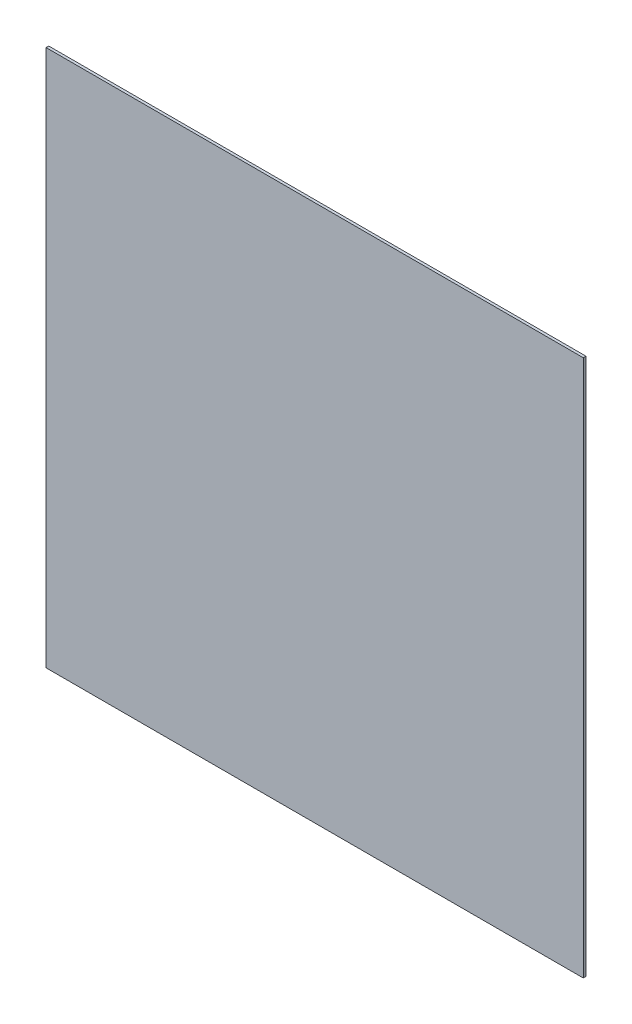
ISO-10303-21;
HEADER;
FILE_DESCRIPTION(('STEP AP214'),'2;1');
FILE_NAME('part.step','',(''),(''),'','','');
FILE_SCHEMA(('AUTOMOTIVE_DESIGN { 1 0 10303 214 1 1 1 1 }'));
ENDSEC;
DATA;
#1=APPLICATION_CONTEXT('core data for automotive mechanical design processes');
#2=APPLICATION_PROTOCOL_DEFINITION('international standard','automotive_design',2000,#1);
#3=PRODUCT_CONTEXT('',#1,'mechanical');
#4=PRODUCT('Part','Part','',(#3));
#5=PRODUCT_RELATED_PRODUCT_CATEGORY('part','',(#4));
#6=PRODUCT_DEFINITION_FORMATION('','',#4);
#7=PRODUCT_DEFINITION_CONTEXT('part definition',#1,'design');
#8=PRODUCT_DEFINITION('design','',#6,#7);
#9=PRODUCT_DEFINITION_SHAPE('','',#8);
#10=(LENGTH_UNIT() NAMED_UNIT(*) SI_UNIT(.MILLI.,.METRE.));
#11=(NAMED_UNIT(*) PLANE_ANGLE_UNIT() SI_UNIT($,.RADIAN.));
#12=(NAMED_UNIT(*) SI_UNIT($,.STERADIAN.) SOLID_ANGLE_UNIT());
#13=UNCERTAINTY_MEASURE_WITH_UNIT(LENGTH_MEASURE(1.E-05),#10,'distance_accuracy_value','');
#14=(GEOMETRIC_REPRESENTATION_CONTEXT(3) GLOBAL_UNCERTAINTY_ASSIGNED_CONTEXT((#13)) GLOBAL_UNIT_ASSIGNED_CONTEXT((#10,
#11,#12)) REPRESENTATION_CONTEXT('',''));
#15=CARTESIAN_POINT('',(0.,0.,0.));
#16=DIRECTION('',(0.,0.,1.));
#17=DIRECTION('',(1.,0.,0.));
#18=AXIS2_PLACEMENT_3D('',#15,#16,#17);
#19=CARTESIAN_POINT('',(113.34,-79.87,1.635));
#20=DIRECTION('',(0.,0.,-1.));
#21=DIRECTION('',(0.,-1.,0.));
#22=AXIS2_PLACEMENT_3D('',#19,#20,#21);
#23=PLANE('',#22);
#24=DIRECTION('',(0.,-1.,0.));
#25=VECTOR('',#24,1.);
#26=CARTESIAN_POINT('',(116.84,-76.37,1.635));
#27=LINE('',#26,#25);
#28=CARTESIAN_POINT('',(116.84,-76.37,1.635));
#29=VERTEX_POINT('',#28);
#30=CARTESIAN_POINT('',(116.84,-83.37,1.635));
#31=VERTEX_POINT('',#30);
#32=EDGE_CURVE('E21',#29,#31,#27,.T.);
#33=ORIENTED_EDGE('',*,*,#32,.F.);
#34=DIRECTION('',(1.,0.,0.));
#35=VECTOR('',#34,1.);
#36=CARTESIAN_POINT('',(109.84,-76.37,1.635));
#37=LINE('',#36,#35);
#38=CARTESIAN_POINT('',(109.84,-76.37,1.635));
#39=VERTEX_POINT('',#38);
#40=EDGE_CURVE('E108',#39,#29,#37,.T.);
#41=ORIENTED_EDGE('',*,*,#40,.F.);
#42=DIRECTION('',(0.,1.,0.));
#43=VECTOR('',#42,1.);
#44=CARTESIAN_POINT('',(109.84,-83.37,1.635));
#45=LINE('',#44,#43);
#46=CARTESIAN_POINT('',(109.84,-83.37,1.635));
#47=VERTEX_POINT('',#46);
#48=EDGE_CURVE('E84',#47,#39,#45,.T.);
#49=ORIENTED_EDGE('',*,*,#48,.F.);
#50=DIRECTION('',(-1.,0.,0.));
#51=VECTOR('',#50,1.);
#52=CARTESIAN_POINT('',(116.84,-83.37,1.635));
#53=LINE('',#52,#51);
#54=EDGE_CURVE('E88',#31,#47,#53,.T.);
#55=ORIENTED_EDGE('',*,*,#54,.F.);
#56=EDGE_LOOP('',(#33,#41,#49,#55));
#57=FACE_BOUND('',#56,.T.);
#58=ADVANCED_FACE('F17',(#57),#23,.F.);
#59=CARTESIAN_POINT('',(113.34,-79.87,1.6));
#60=DIRECTION('',(0.,0.,-1.));
#61=DIRECTION('',(0.,-1.,0.));
#62=AXIS2_PLACEMENT_3D('',#59,#60,#61);
#63=PLANE('',#62);
#64=DIRECTION('',(-1.,0.,0.));
#65=VECTOR('',#64,1.);
#66=CARTESIAN_POINT('',(116.84,-83.37,1.6));
#67=LINE('',#66,#65);
#68=CARTESIAN_POINT('',(116.84,-83.37,1.6));
#69=VERTEX_POINT('',#68);
#70=CARTESIAN_POINT('',(109.84,-83.37,1.6));
#71=VERTEX_POINT('',#70);
#72=EDGE_CURVE('E72',#69,#71,#67,.T.);
#73=ORIENTED_EDGE('',*,*,#72,.T.);
#74=DIRECTION('',(0.,1.,0.));
#75=VECTOR('',#74,1.);
#76=CARTESIAN_POINT('',(109.84,-83.37,1.6));
#77=LINE('',#76,#75);
#78=CARTESIAN_POINT('',(109.84,-76.37,1.6));
#79=VERTEX_POINT('',#78);
#80=EDGE_CURVE('E101',#71,#79,#77,.T.);
#81=ORIENTED_EDGE('',*,*,#80,.T.);
#82=DIRECTION('',(1.,0.,0.));
#83=VECTOR('',#82,1.);
#84=CARTESIAN_POINT('',(109.84,-76.37,1.6));
#85=LINE('',#84,#83);
#86=CARTESIAN_POINT('',(116.84,-76.37,1.6));
#87=VERTEX_POINT('',#86);
#88=EDGE_CURVE('E74',#79,#87,#85,.T.);
#89=ORIENTED_EDGE('',*,*,#88,.T.);
#90=DIRECTION('',(0.,-1.,0.));
#91=VECTOR('',#90,1.);
#92=CARTESIAN_POINT('',(116.84,-76.37,1.6));
#93=LINE('',#92,#91);
#94=EDGE_CURVE('E11',#87,#69,#93,.T.);
#95=ORIENTED_EDGE('',*,*,#94,.T.);
#96=EDGE_LOOP('',(#73,#81,#89,#95));
#97=FACE_BOUND('',#96,.T.);
#98=ADVANCED_FACE('F19',(#97),#63,.T.);
#99=CARTESIAN_POINT('',(116.84,-76.37,1.6));
#100=DIRECTION('',(1.,0.,0.));
#101=DIRECTION('',(0.,1.,0.));
#102=AXIS2_PLACEMENT_3D('',#99,#100,#101);
#103=PLANE('',#102);
#104=DIRECTION('',(0.,0.,1.));
#105=VECTOR('',#104,1.);
#106=CARTESIAN_POINT('',(116.84,-76.37,1.6));
#107=LINE('',#106,#105);
#108=EDGE_CURVE('E112',#87,#29,#107,.T.);
#109=ORIENTED_EDGE('',*,*,#108,.T.);
#110=ORIENTED_EDGE('',*,*,#32,.T.);
#111=DIRECTION('',(0.,0.,1.));
#112=VECTOR('',#111,1.);
#113=CARTESIAN_POINT('',(116.84,-83.37,1.6));
#114=LINE('',#113,#112);
#115=EDGE_CURVE('E80',#69,#31,#114,.T.);
#116=ORIENTED_EDGE('',*,*,#115,.F.);
#117=ORIENTED_EDGE('',*,*,#94,.F.);
#118=EDGE_LOOP('',(#109,#110,#116,#117));
#119=FACE_BOUND('',#118,.T.);
#120=ADVANCED_FACE('F86',(#119),#103,.T.);
#121=CARTESIAN_POINT('',(109.84,-76.37,1.6));
#122=DIRECTION('',(0.,1.,0.));
#123=DIRECTION('',(1.,0.,0.));
#124=AXIS2_PLACEMENT_3D('',#121,#122,#123);
#125=PLANE('',#124);
#126=DIRECTION('',(0.,0.,1.));
#127=VECTOR('',#126,1.);
#128=CARTESIAN_POINT('',(109.84,-76.37,1.6));
#129=LINE('',#128,#127);
#130=EDGE_CURVE('E98',#79,#39,#129,.T.);
#131=ORIENTED_EDGE('',*,*,#130,.T.);
#132=ORIENTED_EDGE('',*,*,#40,.T.);
#133=ORIENTED_EDGE('',*,*,#108,.F.);
#134=ORIENTED_EDGE('',*,*,#88,.F.);
#135=EDGE_LOOP('',(#131,#132,#133,#134));
#136=FACE_BOUND('',#135,.T.);
#137=ADVANCED_FACE('F143',(#136),#125,.T.);
#138=CARTESIAN_POINT('',(109.84,-83.37,1.6));
#139=DIRECTION('',(-1.,0.,0.));
#140=DIRECTION('',(0.,0.,1.));
#141=AXIS2_PLACEMENT_3D('',#138,#139,#140);
#142=PLANE('',#141);
#143=DIRECTION('',(0.,0.,1.));
#144=VECTOR('',#143,1.);
#145=CARTESIAN_POINT('',(109.84,-83.37,1.6));
#146=LINE('',#145,#144);
#147=EDGE_CURVE('E82',#71,#47,#146,.T.);
#148=ORIENTED_EDGE('',*,*,#147,.T.);
#149=ORIENTED_EDGE('',*,*,#48,.T.);
#150=ORIENTED_EDGE('',*,*,#130,.F.);
#151=ORIENTED_EDGE('',*,*,#80,.F.);
#152=EDGE_LOOP('',(#148,#149,#150,#151));
#153=FACE_BOUND('',#152,.T.);
#154=ADVANCED_FACE('F132',(#153),#142,.T.);
#155=CARTESIAN_POINT('',(116.84,-83.37,1.6));
#156=DIRECTION('',(0.,-1.,0.));
#157=DIRECTION('',(0.,0.,-1.));
#158=AXIS2_PLACEMENT_3D('',#155,#156,#157);
#159=PLANE('',#158);
#160=ORIENTED_EDGE('',*,*,#115,.T.);
#161=ORIENTED_EDGE('',*,*,#54,.T.);
#162=ORIENTED_EDGE('',*,*,#147,.F.);
#163=ORIENTED_EDGE('',*,*,#72,.F.);
#164=EDGE_LOOP('',(#160,#161,#162,#163));
#165=FACE_BOUND('',#164,.T.);
#166=ADVANCED_FACE('F78',(#165),#159,.T.);
#167=CLOSED_SHELL('',(#58,#98,#120,#137,#154,#166));
#168=MANIFOLD_SOLID_BREP('B1',#167);
#169=ADVANCED_BREP_SHAPE_REPRESENTATION('',(#18,#168),#14);
#170=SHAPE_DEFINITION_REPRESENTATION(#9,#169);
ENDSEC;
END-ISO-10303-21;
